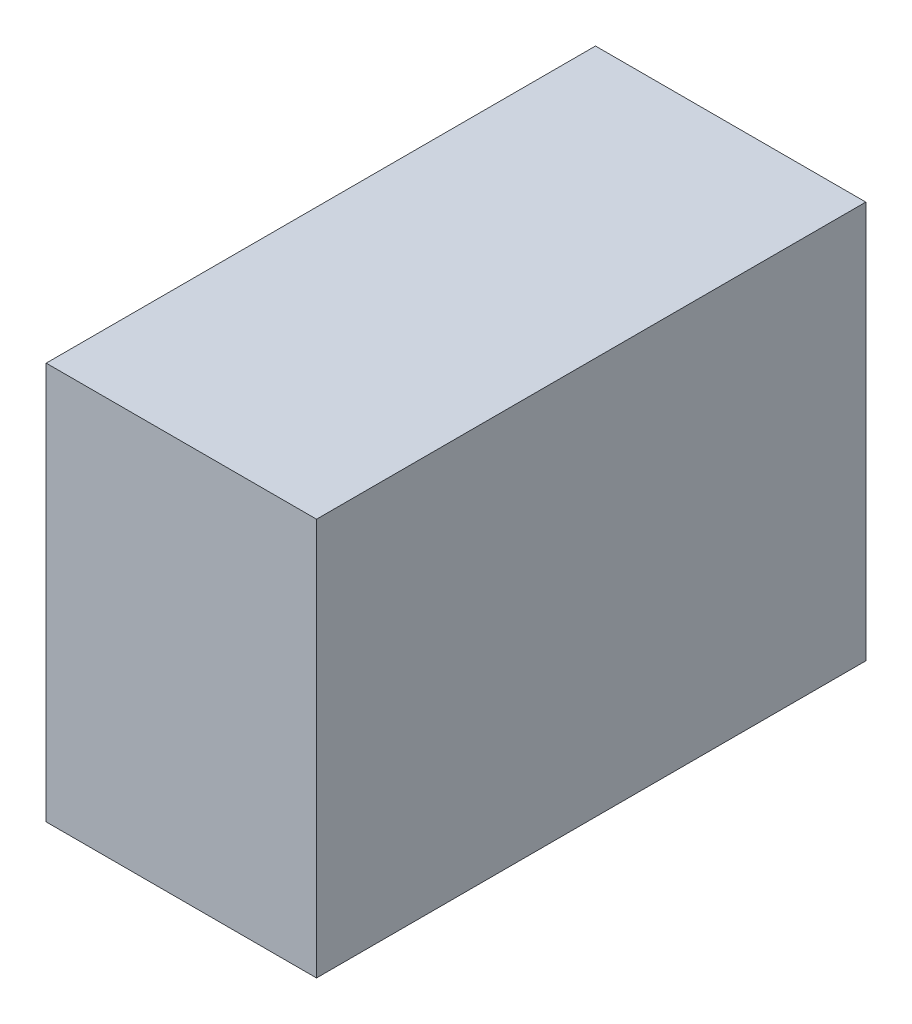
ISO-10303-21;
HEADER;
FILE_DESCRIPTION(('STEP AP214'),'2;1');
FILE_NAME('part.step','',(''),(''),'','','');
FILE_SCHEMA(('AUTOMOTIVE_DESIGN { 1 0 10303 214 1 1 1 1 }'));
ENDSEC;
DATA;
#1=APPLICATION_CONTEXT('core data for automotive mechanical design processes');
#2=APPLICATION_PROTOCOL_DEFINITION('international standard','automotive_design',2000,#1);
#3=PRODUCT_CONTEXT('',#1,'mechanical');
#4=PRODUCT('Part','Part','',(#3));
#5=PRODUCT_RELATED_PRODUCT_CATEGORY('part','',(#4));
#6=PRODUCT_DEFINITION_FORMATION('','',#4);
#7=PRODUCT_DEFINITION_CONTEXT('part definition',#1,'design');
#8=PRODUCT_DEFINITION('design','',#6,#7);
#9=PRODUCT_DEFINITION_SHAPE('','',#8);
#10=(LENGTH_UNIT() NAMED_UNIT(*) SI_UNIT(.MILLI.,.METRE.));
#11=(NAMED_UNIT(*) PLANE_ANGLE_UNIT() SI_UNIT($,.RADIAN.));
#12=(NAMED_UNIT(*) SI_UNIT($,.STERADIAN.) SOLID_ANGLE_UNIT());
#13=UNCERTAINTY_MEASURE_WITH_UNIT(LENGTH_MEASURE(1.E-05),#10,'distance_accuracy_value','');
#14=(GEOMETRIC_REPRESENTATION_CONTEXT(3) GLOBAL_UNCERTAINTY_ASSIGNED_CONTEXT((#13)) GLOBAL_UNIT_ASSIGNED_CONTEXT((#10,
#11,#12)) REPRESENTATION_CONTEXT('',''));
#15=CARTESIAN_POINT('',(0.,0.,0.));
#16=DIRECTION('',(0.,0.,1.));
#17=DIRECTION('',(1.,0.,0.));
#18=AXIS2_PLACEMENT_3D('',#15,#16,#17);
#19=CARTESIAN_POINT('',(0.,58.9102805897463,59.9137679626048));
#20=DIRECTION('',(1.,0.,0.));
#21=DIRECTION('',(0.,1.,0.));
#22=AXIS2_PLACEMENT_3D('',#19,#20,#21);
#23=PLANE('',#22);
#24=DIRECTION('',(0.,-1.,0.));
#25=VECTOR('',#24,1.);
#26=CARTESIAN_POINT('',(0.,59.6452295897463,58.8977679626048));
#27=LINE('',#26,#25);
#28=CARTESIAN_POINT('',(0.,59.6452295897463,58.8977679626048));
#29=VERTEX_POINT('',#28);
#30=CARTESIAN_POINT('',(0.,58.1753315897462,58.8977679626048));
#31=VERTEX_POINT('',#30);
#32=EDGE_CURVE('E27',#29,#31,#27,.T.);
#33=ORIENTED_EDGE('',*,*,#32,.T.);
#34=DIRECTION('',(0.,0.,1.));
#35=VECTOR('',#34,1.);
#36=CARTESIAN_POINT('',(0.,58.1753315897462,58.8977679626048));
#37=LINE('',#36,#35);
#38=CARTESIAN_POINT('',(0.,58.1753315897462,60.9297679626048));
#39=VERTEX_POINT('',#38);
#40=EDGE_CURVE('E94',#31,#39,#37,.T.);
#41=ORIENTED_EDGE('',*,*,#40,.T.);
#42=DIRECTION('',(0.,1.,0.));
#43=VECTOR('',#42,1.);
#44=CARTESIAN_POINT('',(0.,58.1753315897462,60.9297679626048));
#45=LINE('',#44,#43);
#46=CARTESIAN_POINT('',(0.,59.6452295897463,60.9297679626048));
#47=VERTEX_POINT('',#46);
#48=EDGE_CURVE('E77',#39,#47,#45,.T.);
#49=ORIENTED_EDGE('',*,*,#48,.T.);
#50=DIRECTION('',(0.,0.,-1.));
#51=VECTOR('',#50,1.);
#52=CARTESIAN_POINT('',(0.,59.6452295897463,60.9297679626048));
#53=LINE('',#52,#51);
#54=EDGE_CURVE('E99',#47,#29,#53,.T.);
#55=ORIENTED_EDGE('',*,*,#54,.T.);
#56=EDGE_LOOP('',(#33,#41,#49,#55));
#57=FACE_BOUND('',#56,.T.);
#58=ADVANCED_FACE('F16',(#57),#23,.F.);
#59=CARTESIAN_POINT('',(1.,58.9102805897463,59.9137679626048));
#60=DIRECTION('',(1.,0.,0.));
#61=DIRECTION('',(0.,1.,0.));
#62=AXIS2_PLACEMENT_3D('',#59,#60,#61);
#63=PLANE('',#62);
#64=DIRECTION('',(0.,1.,0.));
#65=VECTOR('',#64,1.);
#66=CARTESIAN_POINT('',(1.,59.6452295897463,58.8977679626048));
#67=LINE('',#66,#65);
#68=CARTESIAN_POINT('',(1.,58.1753315897462,58.8977679626048));
#69=VERTEX_POINT('',#68);
#70=CARTESIAN_POINT('',(1.,59.6452295897463,58.8977679626048));
#71=VERTEX_POINT('',#70);
#72=EDGE_CURVE('E11',#69,#71,#67,.T.);
#73=ORIENTED_EDGE('',*,*,#72,.T.);
#74=DIRECTION('',(0.,0.,1.));
#75=VECTOR('',#74,1.);
#76=CARTESIAN_POINT('',(1.,59.6452295897463,60.9297679626048));
#77=LINE('',#76,#75);
#78=CARTESIAN_POINT('',(1.,59.6452295897463,60.9297679626048));
#79=VERTEX_POINT('',#78);
#80=EDGE_CURVE('E71',#71,#79,#77,.T.);
#81=ORIENTED_EDGE('',*,*,#80,.T.);
#82=DIRECTION('',(0.,-1.,0.));
#83=VECTOR('',#82,1.);
#84=CARTESIAN_POINT('',(1.,58.1753315897462,60.9297679626048));
#85=LINE('',#84,#83);
#86=CARTESIAN_POINT('',(1.,58.1753315897462,60.9297679626048));
#87=VERTEX_POINT('',#86);
#88=EDGE_CURVE('E20',#79,#87,#85,.T.);
#89=ORIENTED_EDGE('',*,*,#88,.T.);
#90=DIRECTION('',(0.,0.,-1.));
#91=VECTOR('',#90,1.);
#92=CARTESIAN_POINT('',(1.,58.1753315897462,58.8977679626048));
#93=LINE('',#92,#91);
#94=EDGE_CURVE('E68',#87,#69,#93,.T.);
#95=ORIENTED_EDGE('',*,*,#94,.T.);
#96=EDGE_LOOP('',(#73,#81,#89,#95));
#97=FACE_BOUND('',#96,.T.);
#98=ADVANCED_FACE('F66',(#97),#63,.T.);
#99=CARTESIAN_POINT('',(0.,58.1753315897462,58.8977679626048));
#100=DIRECTION('',(0.,0.,-1.));
#101=DIRECTION('',(0.,-1.,0.));
#102=AXIS2_PLACEMENT_3D('',#99,#100,#101);
#103=PLANE('',#102);
#104=ORIENTED_EDGE('',*,*,#32,.F.);
#105=DIRECTION('',(1.,0.,0.));
#106=VECTOR('',#105,1.);
#107=CARTESIAN_POINT('',(0.,59.6452295897463,58.8977679626048));
#108=LINE('',#107,#106);
#109=EDGE_CURVE('E98',#29,#71,#108,.T.);
#110=ORIENTED_EDGE('',*,*,#109,.T.);
#111=ORIENTED_EDGE('',*,*,#72,.F.);
#112=DIRECTION('',(1.,0.,0.));
#113=VECTOR('',#112,1.);
#114=CARTESIAN_POINT('',(0.,58.1753315897462,58.8977679626048));
#115=LINE('',#114,#113);
#116=EDGE_CURVE('E87',#31,#69,#115,.T.);
#117=ORIENTED_EDGE('',*,*,#116,.F.);
#118=EDGE_LOOP('',(#104,#110,#111,#117));
#119=FACE_BOUND('',#118,.T.);
#120=ADVANCED_FACE('F127',(#119),#103,.T.);
#121=CARTESIAN_POINT('',(0.,59.6452295897463,58.8977679626048));
#122=DIRECTION('',(0.,1.,0.));
#123=DIRECTION('',(1.,0.,0.));
#124=AXIS2_PLACEMENT_3D('',#121,#122,#123);
#125=PLANE('',#124);
#126=ORIENTED_EDGE('',*,*,#54,.F.);
#127=DIRECTION('',(1.,0.,0.));
#128=VECTOR('',#127,1.);
#129=CARTESIAN_POINT('',(0.,59.6452295897463,60.9297679626048));
#130=LINE('',#129,#128);
#131=EDGE_CURVE('E76',#47,#79,#130,.T.);
#132=ORIENTED_EDGE('',*,*,#131,.T.);
#133=ORIENTED_EDGE('',*,*,#80,.F.);
#134=ORIENTED_EDGE('',*,*,#109,.F.);
#135=EDGE_LOOP('',(#126,#132,#133,#134));
#136=FACE_BOUND('',#135,.T.);
#137=ADVANCED_FACE('F132',(#136),#125,.T.);
#138=CARTESIAN_POINT('',(0.,59.6452295897463,60.9297679626048));
#139=DIRECTION('',(0.,0.,1.));
#140=DIRECTION('',(1.,0.,0.));
#141=AXIS2_PLACEMENT_3D('',#138,#139,#140);
#142=PLANE('',#141);
#143=ORIENTED_EDGE('',*,*,#48,.F.);
#144=DIRECTION('',(1.,0.,0.));
#145=VECTOR('',#144,1.);
#146=CARTESIAN_POINT('',(0.,58.1753315897462,60.9297679626048));
#147=LINE('',#146,#145);
#148=EDGE_CURVE('E79',#39,#87,#147,.T.);
#149=ORIENTED_EDGE('',*,*,#148,.T.);
#150=ORIENTED_EDGE('',*,*,#88,.F.);
#151=ORIENTED_EDGE('',*,*,#131,.F.);
#152=EDGE_LOOP('',(#143,#149,#150,#151));
#153=FACE_BOUND('',#152,.T.);
#154=ADVANCED_FACE('F80',(#153),#142,.T.);
#155=CARTESIAN_POINT('',(0.,58.1753315897462,60.9297679626048));
#156=DIRECTION('',(0.,-1.,0.));
#157=DIRECTION('',(0.,0.,-1.));
#158=AXIS2_PLACEMENT_3D('',#155,#156,#157);
#159=PLANE('',#158);
#160=ORIENTED_EDGE('',*,*,#40,.F.);
#161=ORIENTED_EDGE('',*,*,#116,.T.);
#162=ORIENTED_EDGE('',*,*,#94,.F.);
#163=ORIENTED_EDGE('',*,*,#148,.F.);
#164=EDGE_LOOP('',(#160,#161,#162,#163));
#165=FACE_BOUND('',#164,.T.);
#166=ADVANCED_FACE('F18',(#165),#159,.T.);
#167=CLOSED_SHELL('',(#58,#98,#120,#137,#154,#166));
#168=MANIFOLD_SOLID_BREP('B1',#167);
#169=ADVANCED_BREP_SHAPE_REPRESENTATION('',(#18,#168),#14);
#170=SHAPE_DEFINITION_REPRESENTATION(#9,#169);
ENDSEC;
END-ISO-10303-21;
